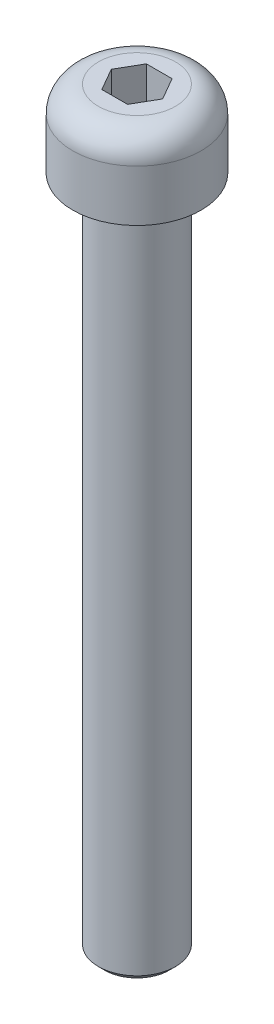
ISO-10303-21;
HEADER;
FILE_DESCRIPTION(('STEP AP214'),'2;1');
FILE_NAME('part.step','',(''),(''),'','','');
FILE_SCHEMA(('AUTOMOTIVE_DESIGN { 1 0 10303 214 1 1 1 1 }'));
ENDSEC;
DATA;
#1=APPLICATION_CONTEXT('core data for automotive mechanical design processes');
#2=APPLICATION_PROTOCOL_DEFINITION('international standard','automotive_design',2000,#1);
#3=PRODUCT_CONTEXT('',#1,'mechanical');
#4=PRODUCT('Part','Part','',(#3));
#5=PRODUCT_RELATED_PRODUCT_CATEGORY('part','',(#4));
#6=PRODUCT_DEFINITION_FORMATION('','',#4);
#7=PRODUCT_DEFINITION_CONTEXT('part definition',#1,'design');
#8=PRODUCT_DEFINITION('design','',#6,#7);
#9=PRODUCT_DEFINITION_SHAPE('','',#8);
#10=(LENGTH_UNIT() NAMED_UNIT(*) SI_UNIT(.MILLI.,.METRE.));
#11=(NAMED_UNIT(*) PLANE_ANGLE_UNIT() SI_UNIT($,.RADIAN.));
#12=(NAMED_UNIT(*) SI_UNIT($,.STERADIAN.) SOLID_ANGLE_UNIT());
#13=UNCERTAINTY_MEASURE_WITH_UNIT(LENGTH_MEASURE(1.E-05),#10,'distance_accuracy_value','');
#14=(GEOMETRIC_REPRESENTATION_CONTEXT(3) GLOBAL_UNCERTAINTY_ASSIGNED_CONTEXT((#13)) GLOBAL_UNIT_ASSIGNED_CONTEXT((#10,
#11,#12)) REPRESENTATION_CONTEXT('',''));
#15=CARTESIAN_POINT('',(0.,0.,0.));
#16=DIRECTION('',(0.,0.,1.));
#17=DIRECTION('',(1.,0.,0.));
#18=AXIS2_PLACEMENT_3D('',#15,#16,#17);
#19=CARTESIAN_POINT('',(0.,26.25,0.));
#20=DIRECTION('',(0.,-1.,0.));
#21=DIRECTION('',(0.,0.,-1.));
#22=AXIS2_PLACEMENT_3D('',#19,#20,#21);
#23=CYLINDRICAL_SURFACE('',#22,1.5);
#24=CARTESIAN_POINT('',(0.,0.249999999999997,0.));
#25=DIRECTION('',(0.,1.,0.));
#26=DIRECTION('',(0.,0.,1.));
#27=AXIS2_PLACEMENT_3D('',#24,#25,#26);
#28=CIRCLE('',#27,1.5);
#29=CARTESIAN_POINT('',(0.,0.249999999999997,1.5));
#30=VERTEX_POINT('',#29);
#31=EDGE_CURVE('E49',#30,#30,#28,.T.);
#32=ORIENTED_EDGE('',*,*,#31,.T.);
#33=EDGE_LOOP('',(#32));
#34=FACE_BOUND('',#33,.T.);
#35=CARTESIAN_POINT('',(0.,26.25,0.));
#36=DIRECTION('',(0.,1.,0.));
#37=DIRECTION('',(0.,0.,1.));
#38=AXIS2_PLACEMENT_3D('',#35,#36,#37);
#39=CIRCLE('',#38,1.5);
#40=CARTESIAN_POINT('',(0.,26.25,1.5));
#41=VERTEX_POINT('',#40);
#42=EDGE_CURVE('E151',#41,#41,#39,.T.);
#43=ORIENTED_EDGE('',*,*,#42,.F.);
#44=EDGE_LOOP('',(#43));
#45=FACE_BOUND('',#44,.T.);
#46=ADVANCED_FACE('F41',(#34,#45),#23,.T.);
#47=CARTESIAN_POINT('',(0.,0.,0.));
#48=DIRECTION('',(0.,1.,0.));
#49=DIRECTION('',(0.,0.,1.));
#50=AXIS2_PLACEMENT_3D('',#47,#48,#49);
#51=PLANE('',#50);
#52=CARTESIAN_POINT('',(0.,0.,0.));
#53=DIRECTION('',(0.,1.,0.));
#54=DIRECTION('',(0.,0.,1.));
#55=AXIS2_PLACEMENT_3D('',#52,#53,#54);
#56=CIRCLE('',#55,1.25);
#57=CARTESIAN_POINT('',(0.,0.,1.25));
#58=VERTEX_POINT('',#57);
#59=EDGE_CURVE('E11',#58,#58,#56,.F.);
#60=ORIENTED_EDGE('',*,*,#59,.T.);
#61=EDGE_LOOP('',(#60));
#62=FACE_BOUND('',#61,.T.);
#63=ADVANCED_FACE('F180',(#62),#51,.F.);
#64=CARTESIAN_POINT('',(0.,29.25,0.));
#65=DIRECTION('',(0.,-1.,0.));
#66=DIRECTION('',(0.,0.,-1.));
#67=AXIS2_PLACEMENT_3D('',#64,#65,#66);
#68=CYLINDRICAL_SURFACE('',#67,2.5);
#69=CARTESIAN_POINT('',(0.,28.25,0.));
#70=DIRECTION('',(0.,1.,0.));
#71=DIRECTION('',(0.,0.,1.));
#72=AXIS2_PLACEMENT_3D('',#69,#70,#71);
#73=CIRCLE('',#72,2.5);
#74=CARTESIAN_POINT('',(0.,28.25,2.5));
#75=VERTEX_POINT('',#74);
#76=EDGE_CURVE('E157',#75,#75,#73,.F.);
#77=ORIENTED_EDGE('',*,*,#76,.T.);
#78=EDGE_LOOP('',(#77));
#79=FACE_BOUND('',#78,.T.);
#80=CARTESIAN_POINT('',(0.,26.25,0.));
#81=DIRECTION('',(0.,1.,0.));
#82=DIRECTION('',(0.,0.,1.));
#83=AXIS2_PLACEMENT_3D('',#80,#81,#82);
#84=CIRCLE('',#83,2.5);
#85=CARTESIAN_POINT('',(0.,26.25,2.5));
#86=VERTEX_POINT('',#85);
#87=EDGE_CURVE('E143',#86,#86,#84,.T.);
#88=ORIENTED_EDGE('',*,*,#87,.T.);
#89=EDGE_LOOP('',(#88));
#90=FACE_BOUND('',#89,.T.);
#91=ADVANCED_FACE('F184',(#79,#90),#68,.T.);
#92=CARTESIAN_POINT('',(0.,29.25,0.));
#93=DIRECTION('',(0.,1.,0.));
#94=DIRECTION('',(0.,0.,1.));
#95=AXIS2_PLACEMENT_3D('',#92,#93,#94);
#96=PLANE('',#95);
#97=DIRECTION('',(-0.499999999999999,0.,0.866025403784439));
#98=VECTOR('',#97,1.);
#99=CARTESIAN_POINT('',(-0.5,29.25,-0.866025403784439));
#100=LINE('',#99,#98);
#101=CARTESIAN_POINT('',(-0.5,29.25,-0.866025403784439));
#102=VERTEX_POINT('',#101);
#103=CARTESIAN_POINT('',(-1.,29.25,0.));
#104=VERTEX_POINT('',#103);
#105=EDGE_CURVE('E56',#102,#104,#100,.T.);
#106=ORIENTED_EDGE('',*,*,#105,.F.);
#107=DIRECTION('',(-1.,0.,0.));
#108=VECTOR('',#107,1.);
#109=CARTESIAN_POINT('',(0.5,29.25,-0.866025403784439));
#110=LINE('',#109,#108);
#111=CARTESIAN_POINT('',(0.5,29.25,-0.866025403784439));
#112=VERTEX_POINT('',#111);
#113=EDGE_CURVE('E139',#112,#102,#110,.T.);
#114=ORIENTED_EDGE('',*,*,#113,.F.);
#115=DIRECTION('',(-0.5,0.,-0.866025403784439));
#116=VECTOR('',#115,1.);
#117=CARTESIAN_POINT('',(1.,29.25,0.));
#118=LINE('',#117,#116);
#119=CARTESIAN_POINT('',(1.,29.25,0.));
#120=VERTEX_POINT('',#119);
#121=EDGE_CURVE('E137',#120,#112,#118,.T.);
#122=ORIENTED_EDGE('',*,*,#121,.F.);
#123=DIRECTION('',(0.5,0.,-0.866025403784439));
#124=VECTOR('',#123,1.);
#125=CARTESIAN_POINT('',(0.5,29.25,0.866025403784439));
#126=LINE('',#125,#124);
#127=CARTESIAN_POINT('',(0.5,29.25,0.866025403784439));
#128=VERTEX_POINT('',#127);
#129=EDGE_CURVE('E104',#128,#120,#126,.T.);
#130=ORIENTED_EDGE('',*,*,#129,.F.);
#131=DIRECTION('',(1.,0.,0.));
#132=VECTOR('',#131,1.);
#133=CARTESIAN_POINT('',(-0.5,29.25,0.866025403784439));
#134=LINE('',#133,#132);
#135=CARTESIAN_POINT('',(-0.5,29.25,0.866025403784439));
#136=VERTEX_POINT('',#135);
#137=EDGE_CURVE('E133',#136,#128,#134,.T.);
#138=ORIENTED_EDGE('',*,*,#137,.F.);
#139=DIRECTION('',(0.5,0.,0.866025403784439));
#140=VECTOR('',#139,1.);
#141=CARTESIAN_POINT('',(-1.,29.25,0.));
#142=LINE('',#141,#140);
#143=EDGE_CURVE('E130',#104,#136,#142,.T.);
#144=ORIENTED_EDGE('',*,*,#143,.F.);
#145=EDGE_LOOP('',(#106,#114,#122,#130,#138,#144));
#146=FACE_BOUND('',#145,.T.);
#147=CARTESIAN_POINT('',(0.,29.25,0.));
#148=DIRECTION('',(0.,1.,0.));
#149=DIRECTION('',(0.,0.,1.));
#150=AXIS2_PLACEMENT_3D('',#147,#148,#149);
#151=CIRCLE('',#150,1.5);
#152=CARTESIAN_POINT('',(0.,29.25,1.5));
#153=VERTEX_POINT('',#152);
#154=EDGE_CURVE('E154',#153,#153,#151,.T.);
#155=ORIENTED_EDGE('',*,*,#154,.T.);
#156=EDGE_LOOP('',(#155));
#157=FACE_BOUND('',#156,.T.);
#158=ADVANCED_FACE('F190',(#146,#157),#96,.T.);
#159=CARTESIAN_POINT('',(0.,26.25,0.));
#160=DIRECTION('',(0.,1.,0.));
#161=DIRECTION('',(0.,0.,1.));
#162=AXIS2_PLACEMENT_3D('',#159,#160,#161);
#163=PLANE('',#162);
#164=ORIENTED_EDGE('',*,*,#42,.T.);
#165=EDGE_LOOP('',(#164));
#166=FACE_BOUND('',#165,.T.);
#167=ORIENTED_EDGE('',*,*,#87,.F.);
#168=EDGE_LOOP('',(#167));
#169=FACE_BOUND('',#168,.T.);
#170=ADVANCED_FACE('F176',(#166,#169),#163,.F.);
#171=CARTESIAN_POINT('',(0.,28.25,0.));
#172=DIRECTION('',(0.,1.,0.));
#173=DIRECTION('',(0.,0.,1.));
#174=AXIS2_PLACEMENT_3D('',#171,#172,#173);
#175=TOROIDAL_SURFACE('',#174,1.5,1.);
#176=ORIENTED_EDGE('',*,*,#76,.F.);
#177=EDGE_LOOP('',(#176));
#178=FACE_BOUND('',#177,.T.);
#179=ORIENTED_EDGE('',*,*,#154,.F.);
#180=EDGE_LOOP('',(#179));
#181=FACE_BOUND('',#180,.T.);
#182=ADVANCED_FACE('F166',(#178,#181),#175,.T.);
#183=CARTESIAN_POINT('',(0.,0.249999999999997,0.));
#184=DIRECTION('',(0.,1.,0.));
#185=DIRECTION('',(0.,0.,1.));
#186=AXIS2_PLACEMENT_3D('',#183,#184,#185);
#187=CONICAL_SURFACE('',#186,1.5,0.785398163397453);
#188=ORIENTED_EDGE('',*,*,#59,.F.);
#189=EDGE_LOOP('',(#188));
#190=FACE_BOUND('',#189,.T.);
#191=ORIENTED_EDGE('',*,*,#31,.F.);
#192=EDGE_LOOP('',(#191));
#193=FACE_BOUND('',#192,.T.);
#194=ADVANCED_FACE('F43',(#190,#193),#187,.T.);
#195=CARTESIAN_POINT('',(-0.5,27.25,-0.866025403784439));
#196=DIRECTION('',(-0.866025403784439,0.,-0.499999999999999));
#197=DIRECTION('',(-0.5,0.,0.866025403784439));
#198=AXIS2_PLACEMENT_3D('',#195,#196,#197);
#199=PLANE('',#198);
#200=ORIENTED_EDGE('',*,*,#105,.T.);
#201=DIRECTION('',(0.,1.,0.));
#202=VECTOR('',#201,1.);
#203=CARTESIAN_POINT('',(-1.,27.25,0.));
#204=LINE('',#203,#202);
#205=CARTESIAN_POINT('',(-1.,27.25,0.));
#206=VERTEX_POINT('',#205);
#207=EDGE_CURVE('E86',#206,#104,#204,.T.);
#208=ORIENTED_EDGE('',*,*,#207,.F.);
#209=DIRECTION('',(-0.499999999999999,0.,0.866025403784439));
#210=VECTOR('',#209,1.);
#211=CARTESIAN_POINT('',(-0.5,27.25,-0.866025403784439));
#212=LINE('',#211,#210);
#213=CARTESIAN_POINT('',(-0.5,27.25,-0.866025403784439));
#214=VERTEX_POINT('',#213);
#215=EDGE_CURVE('E141',#214,#206,#212,.T.);
#216=ORIENTED_EDGE('',*,*,#215,.F.);
#217=DIRECTION('',(0.,1.,0.));
#218=VECTOR('',#217,1.);
#219=CARTESIAN_POINT('',(-0.5,27.25,-0.866025403784439));
#220=LINE('',#219,#218);
#221=EDGE_CURVE('E64',#214,#102,#220,.T.);
#222=ORIENTED_EDGE('',*,*,#221,.T.);
#223=EDGE_LOOP('',(#200,#208,#216,#222));
#224=FACE_BOUND('',#223,.T.);
#225=ADVANCED_FACE('F165',(#224),#199,.F.);
#226=CARTESIAN_POINT('',(0.5,27.25,-0.866025403784439));
#227=DIRECTION('',(0.,0.,-1.));
#228=DIRECTION('',(-1.,0.,0.));
#229=AXIS2_PLACEMENT_3D('',#226,#227,#228);
#230=PLANE('',#229);
#231=ORIENTED_EDGE('',*,*,#113,.T.);
#232=ORIENTED_EDGE('',*,*,#221,.F.);
#233=DIRECTION('',(-1.,0.,0.));
#234=VECTOR('',#233,1.);
#235=CARTESIAN_POINT('',(0.5,27.25,-0.866025403784439));
#236=LINE('',#235,#234);
#237=CARTESIAN_POINT('',(0.5,27.25,-0.866025403784439));
#238=VERTEX_POINT('',#237);
#239=EDGE_CURVE('E116',#238,#214,#236,.T.);
#240=ORIENTED_EDGE('',*,*,#239,.F.);
#241=DIRECTION('',(0.,1.,0.));
#242=VECTOR('',#241,1.);
#243=CARTESIAN_POINT('',(0.5,27.25,-0.866025403784439));
#244=LINE('',#243,#242);
#245=EDGE_CURVE('E108',#238,#112,#244,.T.);
#246=ORIENTED_EDGE('',*,*,#245,.T.);
#247=EDGE_LOOP('',(#231,#232,#240,#246));
#248=FACE_BOUND('',#247,.T.);
#249=ADVANCED_FACE('F173',(#248),#230,.F.);
#250=CARTESIAN_POINT('',(1.,27.25,0.));
#251=DIRECTION('',(0.866025403784439,0.,-0.5));
#252=DIRECTION('',(-0.5,0.,-0.866025403784439));
#253=AXIS2_PLACEMENT_3D('',#250,#251,#252);
#254=PLANE('',#253);
#255=ORIENTED_EDGE('',*,*,#121,.T.);
#256=ORIENTED_EDGE('',*,*,#245,.F.);
#257=DIRECTION('',(-0.5,0.,-0.866025403784439));
#258=VECTOR('',#257,1.);
#259=CARTESIAN_POINT('',(1.,27.25,0.));
#260=LINE('',#259,#258);
#261=CARTESIAN_POINT('',(1.,27.25,0.));
#262=VERTEX_POINT('',#261);
#263=EDGE_CURVE('E112',#262,#238,#260,.T.);
#264=ORIENTED_EDGE('',*,*,#263,.F.);
#265=DIRECTION('',(0.,1.,0.));
#266=VECTOR('',#265,1.);
#267=CARTESIAN_POINT('',(1.,27.25,0.));
#268=LINE('',#267,#266);
#269=EDGE_CURVE('E97',#262,#120,#268,.T.);
#270=ORIENTED_EDGE('',*,*,#269,.T.);
#271=EDGE_LOOP('',(#255,#256,#264,#270));
#272=FACE_BOUND('',#271,.T.);
#273=ADVANCED_FACE('F113',(#272),#254,.F.);
#274=CARTESIAN_POINT('',(0.5,27.25,0.866025403784439));
#275=DIRECTION('',(0.866025403784439,0.,0.5));
#276=DIRECTION('',(0.5,0.,-0.866025403784439));
#277=AXIS2_PLACEMENT_3D('',#274,#275,#276);
#278=PLANE('',#277);
#279=ORIENTED_EDGE('',*,*,#129,.T.);
#280=ORIENTED_EDGE('',*,*,#269,.F.);
#281=DIRECTION('',(0.5,0.,-0.866025403784439));
#282=VECTOR('',#281,1.);
#283=CARTESIAN_POINT('',(0.5,27.25,0.866025403784439));
#284=LINE('',#283,#282);
#285=CARTESIAN_POINT('',(0.5,27.25,0.866025403784439));
#286=VERTEX_POINT('',#285);
#287=EDGE_CURVE('E101',#286,#262,#284,.T.);
#288=ORIENTED_EDGE('',*,*,#287,.F.);
#289=DIRECTION('',(0.,1.,0.));
#290=VECTOR('',#289,1.);
#291=CARTESIAN_POINT('',(0.5,27.25,0.866025403784439));
#292=LINE('',#291,#290);
#293=EDGE_CURVE('E109',#286,#128,#292,.T.);
#294=ORIENTED_EDGE('',*,*,#293,.T.);
#295=EDGE_LOOP('',(#279,#280,#288,#294));
#296=FACE_BOUND('',#295,.T.);
#297=ADVANCED_FACE('F99',(#296),#278,.F.);
#298=CARTESIAN_POINT('',(-0.5,27.25,0.866025403784439));
#299=DIRECTION('',(0.,0.,1.));
#300=DIRECTION('',(1.,0.,0.));
#301=AXIS2_PLACEMENT_3D('',#298,#299,#300);
#302=PLANE('',#301);
#303=ORIENTED_EDGE('',*,*,#137,.T.);
#304=ORIENTED_EDGE('',*,*,#293,.F.);
#305=DIRECTION('',(1.,0.,0.));
#306=VECTOR('',#305,1.);
#307=CARTESIAN_POINT('',(-0.5,27.25,0.866025403784439));
#308=LINE('',#307,#306);
#309=CARTESIAN_POINT('',(-0.5,27.25,0.866025403784439));
#310=VERTEX_POINT('',#309);
#311=EDGE_CURVE('E122',#310,#286,#308,.T.);
#312=ORIENTED_EDGE('',*,*,#311,.F.);
#313=DIRECTION('',(0.,1.,0.));
#314=VECTOR('',#313,1.);
#315=CARTESIAN_POINT('',(-0.5,27.25,0.866025403784439));
#316=LINE('',#315,#314);
#317=EDGE_CURVE('E146',#310,#136,#316,.T.);
#318=ORIENTED_EDGE('',*,*,#317,.T.);
#319=EDGE_LOOP('',(#303,#304,#312,#318));
#320=FACE_BOUND('',#319,.T.);
#321=ADVANCED_FACE('F200',(#320),#302,.F.);
#322=CARTESIAN_POINT('',(-1.,27.25,0.));
#323=DIRECTION('',(-0.866025403784439,0.,0.5));
#324=DIRECTION('',(0.5,0.,0.866025403784439));
#325=AXIS2_PLACEMENT_3D('',#322,#323,#324);
#326=PLANE('',#325);
#327=ORIENTED_EDGE('',*,*,#143,.T.);
#328=ORIENTED_EDGE('',*,*,#317,.F.);
#329=DIRECTION('',(0.5,0.,0.866025403784439));
#330=VECTOR('',#329,1.);
#331=CARTESIAN_POINT('',(-1.,27.25,0.));
#332=LINE('',#331,#330);
#333=EDGE_CURVE('E124',#206,#310,#332,.T.);
#334=ORIENTED_EDGE('',*,*,#333,.F.);
#335=ORIENTED_EDGE('',*,*,#207,.T.);
#336=EDGE_LOOP('',(#327,#328,#334,#335));
#337=FACE_BOUND('',#336,.T.);
#338=ADVANCED_FACE('F197',(#337),#326,.F.);
#339=CARTESIAN_POINT('',(0.,27.25,0.));
#340=DIRECTION('',(0.,1.,0.));
#341=DIRECTION('',(0.,0.,1.));
#342=AXIS2_PLACEMENT_3D('',#339,#340,#341);
#343=PLANE('',#342);
#344=ORIENTED_EDGE('',*,*,#215,.T.);
#345=ORIENTED_EDGE('',*,*,#333,.T.);
#346=ORIENTED_EDGE('',*,*,#311,.T.);
#347=ORIENTED_EDGE('',*,*,#287,.T.);
#348=ORIENTED_EDGE('',*,*,#263,.T.);
#349=ORIENTED_EDGE('',*,*,#239,.T.);
#350=EDGE_LOOP('',(#344,#345,#346,#347,#348,#349));
#351=FACE_BOUND('',#350,.T.);
#352=ADVANCED_FACE('F119',(#351),#343,.T.);
#353=CLOSED_SHELL('',(#46,#63,#91,#158,#170,#182,#194,#225,#249,#273,#297,#321,#338,#352));
#354=MANIFOLD_SOLID_BREP('B2',#353);
#355=ADVANCED_BREP_SHAPE_REPRESENTATION('',(#18,#354),#14);
#356=SHAPE_DEFINITION_REPRESENTATION(#9,#355);
ENDSEC;
END-ISO-10303-21;
